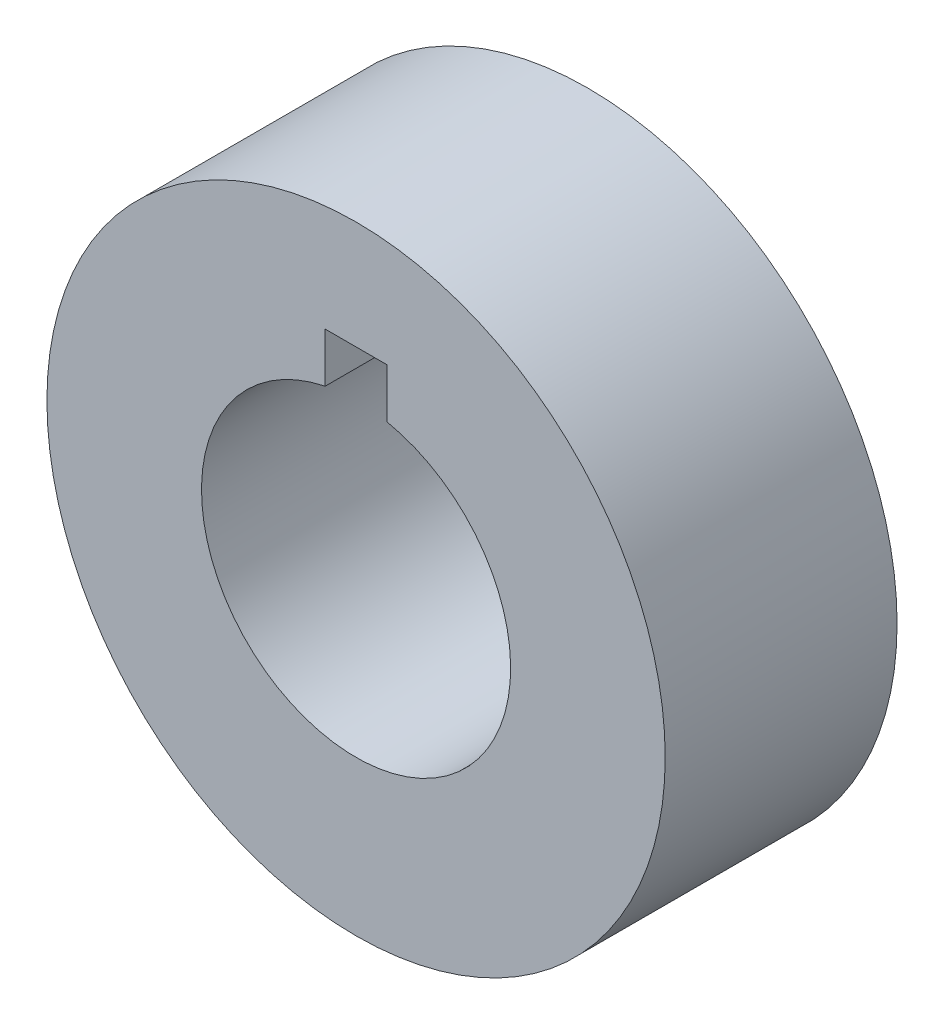
ISO-10303-21;
HEADER;
FILE_DESCRIPTION(('STEP AP214'),'2;1');
FILE_NAME('part.step','',(''),(''),'','','');
FILE_SCHEMA(('AUTOMOTIVE_DESIGN { 1 0 10303 214 1 1 1 1 }'));
ENDSEC;
DATA;
#1=APPLICATION_CONTEXT('core data for automotive mechanical design processes');
#2=APPLICATION_PROTOCOL_DEFINITION('international standard','automotive_design',2000,#1);
#3=PRODUCT_CONTEXT('',#1,'mechanical');
#4=PRODUCT('Part','Part','',(#3));
#5=PRODUCT_RELATED_PRODUCT_CATEGORY('part','',(#4));
#6=PRODUCT_DEFINITION_FORMATION('','',#4);
#7=PRODUCT_DEFINITION_CONTEXT('part definition',#1,'design');
#8=PRODUCT_DEFINITION('design','',#6,#7);
#9=PRODUCT_DEFINITION_SHAPE('','',#8);
#10=(LENGTH_UNIT() NAMED_UNIT(*) SI_UNIT(.MILLI.,.METRE.));
#11=(NAMED_UNIT(*) PLANE_ANGLE_UNIT() SI_UNIT($,.RADIAN.));
#12=(NAMED_UNIT(*) SI_UNIT($,.STERADIAN.) SOLID_ANGLE_UNIT());
#13=UNCERTAINTY_MEASURE_WITH_UNIT(LENGTH_MEASURE(1.E-05),#10,'distance_accuracy_value','');
#14=(GEOMETRIC_REPRESENTATION_CONTEXT(3) GLOBAL_UNCERTAINTY_ASSIGNED_CONTEXT((#13)) GLOBAL_UNIT_ASSIGNED_CONTEXT((#10,
#11,#12)) REPRESENTATION_CONTEXT('',''));
#15=CARTESIAN_POINT('',(0.,0.,0.));
#16=DIRECTION('',(0.,0.,1.));
#17=DIRECTION('',(1.,0.,0.));
#18=AXIS2_PLACEMENT_3D('',#15,#16,#17);
#19=CARTESIAN_POINT('',(0.,0.,19.05));
#20=DIRECTION('',(0.,0.,1.));
#21=DIRECTION('',(1.,0.,0.));
#22=AXIS2_PLACEMENT_3D('',#19,#20,#21);
#23=PLANE('',#22);
#24=CARTESIAN_POINT('',(0.,0.,19.05));
#25=DIRECTION('',(0.,0.,1.));
#26=DIRECTION('',(1.,0.,0.));
#27=AXIS2_PLACEMENT_3D('',#24,#25,#26);
#28=CIRCLE('',#27,25.4);
#29=CARTESIAN_POINT('',(-25.4,0.,19.05));
#30=VERTEX_POINT('',#29);
#31=EDGE_CURVE('E11',#30,#30,#28,.T.);
#32=ORIENTED_EDGE('',*,*,#31,.T.);
#33=EDGE_LOOP('',(#32));
#34=FACE_BOUND('',#33,.T.);
#35=CARTESIAN_POINT('',(0.,0.,19.05));
#36=DIRECTION('',(0.,0.,1.));
#37=DIRECTION('',(1.,0.,0.));
#38=AXIS2_PLACEMENT_3D('',#35,#36,#37);
#39=CIRCLE('',#38,12.7);
#40=CARTESIAN_POINT('',(-2.54,12.4434078933385,19.05));
#41=VERTEX_POINT('',#40);
#42=CARTESIAN_POINT('',(2.54,12.4434078933385,19.05));
#43=VERTEX_POINT('',#42);
#44=EDGE_CURVE('E82',#41,#43,#39,.T.);
#45=ORIENTED_EDGE('',*,*,#44,.F.);
#46=DIRECTION('',(0.,-1.,0.));
#47=VECTOR('',#46,1.);
#48=CARTESIAN_POINT('',(-2.54,16.51,19.05));
#49=LINE('',#48,#47);
#50=CARTESIAN_POINT('',(-2.54,16.51,19.05));
#51=VERTEX_POINT('',#50);
#52=EDGE_CURVE('E74',#51,#41,#49,.T.);
#53=ORIENTED_EDGE('',*,*,#52,.F.);
#54=DIRECTION('',(-1.,0.,0.));
#55=VECTOR('',#54,1.);
#56=CARTESIAN_POINT('',(-2.54,16.51,19.05));
#57=LINE('',#56,#55);
#58=CARTESIAN_POINT('',(2.54,16.51,19.05));
#59=VERTEX_POINT('',#58);
#60=EDGE_CURVE('E95',#59,#51,#57,.T.);
#61=ORIENTED_EDGE('',*,*,#60,.F.);
#62=DIRECTION('',(0.,1.,0.));
#63=VECTOR('',#62,1.);
#64=CARTESIAN_POINT('',(2.54,16.51,19.05));
#65=LINE('',#64,#63);
#66=EDGE_CURVE('E93',#43,#59,#65,.T.);
#67=ORIENTED_EDGE('',*,*,#66,.F.);
#68=EDGE_LOOP('',(#45,#53,#61,#67));
#69=FACE_BOUND('',#68,.T.);
#70=ADVANCED_FACE('F33',(#34,#69),#23,.T.);
#71=CARTESIAN_POINT('',(0.,0.,0.));
#72=DIRECTION('',(0.,0.,1.));
#73=DIRECTION('',(1.,0.,0.));
#74=AXIS2_PLACEMENT_3D('',#71,#72,#73);
#75=PLANE('',#74);
#76=CARTESIAN_POINT('',(0.,0.,0.));
#77=DIRECTION('',(0.,0.,1.));
#78=DIRECTION('',(1.,0.,0.));
#79=AXIS2_PLACEMENT_3D('',#76,#77,#78);
#80=CIRCLE('',#79,25.4);
#81=CARTESIAN_POINT('',(-25.4,0.,0.));
#82=VERTEX_POINT('',#81);
#83=EDGE_CURVE('E37',#82,#82,#80,.T.);
#84=ORIENTED_EDGE('',*,*,#83,.F.);
#85=EDGE_LOOP('',(#84));
#86=FACE_BOUND('',#85,.T.);
#87=DIRECTION('',(0.,-1.,0.));
#88=VECTOR('',#87,1.);
#89=CARTESIAN_POINT('',(-2.54,16.51,0.));
#90=LINE('',#89,#88);
#91=CARTESIAN_POINT('',(-2.54,16.51,0.));
#92=VERTEX_POINT('',#91);
#93=CARTESIAN_POINT('',(-2.54,12.4434078933385,0.));
#94=VERTEX_POINT('',#93);
#95=EDGE_CURVE('E56',#92,#94,#90,.T.);
#96=ORIENTED_EDGE('',*,*,#95,.T.);
#97=CARTESIAN_POINT('',(0.,0.,0.));
#98=DIRECTION('',(0.,0.,1.));
#99=DIRECTION('',(1.,0.,0.));
#100=AXIS2_PLACEMENT_3D('',#97,#98,#99);
#101=CIRCLE('',#100,12.7);
#102=CARTESIAN_POINT('',(2.54,12.4434078933385,0.));
#103=VERTEX_POINT('',#102);
#104=EDGE_CURVE('E89',#94,#103,#101,.T.);
#105=ORIENTED_EDGE('',*,*,#104,.T.);
#106=DIRECTION('',(0.,1.,0.));
#107=VECTOR('',#106,1.);
#108=CARTESIAN_POINT('',(2.54,16.51,0.));
#109=LINE('',#108,#107);
#110=CARTESIAN_POINT('',(2.54,16.51,0.));
#111=VERTEX_POINT('',#110);
#112=EDGE_CURVE('E101',#103,#111,#109,.T.);
#113=ORIENTED_EDGE('',*,*,#112,.T.);
#114=DIRECTION('',(-1.,0.,0.));
#115=VECTOR('',#114,1.);
#116=CARTESIAN_POINT('',(-2.54,16.51,0.));
#117=LINE('',#116,#115);
#118=EDGE_CURVE('E83',#111,#92,#117,.T.);
#119=ORIENTED_EDGE('',*,*,#118,.T.);
#120=EDGE_LOOP('',(#96,#105,#113,#119));
#121=FACE_BOUND('',#120,.T.);
#122=ADVANCED_FACE('F112',(#86,#121),#75,.F.);
#123=CARTESIAN_POINT('',(0.,0.,19.05));
#124=DIRECTION('',(0.,0.,-1.));
#125=DIRECTION('',(-1.,0.,0.));
#126=AXIS2_PLACEMENT_3D('',#123,#124,#125);
#127=CYLINDRICAL_SURFACE('',#126,25.4);
#128=CARTESIAN_POINT('',(-25.4,0.,19.05));
#129=CARTESIAN_POINT('',(-25.4,0.,18.8515625));
#130=CARTESIAN_POINT('',(-25.4,0.,18.653125));
#131=CARTESIAN_POINT('',(-25.4,0.,18.25625));
#132=CARTESIAN_POINT('',(-25.4,0.,18.0578125));
#133=CARTESIAN_POINT('',(-25.4,0.,17.6609375));
#134=CARTESIAN_POINT('',(-25.4,0.,17.4625));
#135=CARTESIAN_POINT('',(-25.4,0.,17.065625));
#136=CARTESIAN_POINT('',(-25.4,0.,16.8671875));
#137=CARTESIAN_POINT('',(-25.4,0.,16.4703125));
#138=CARTESIAN_POINT('',(-25.4,0.,16.271875));
#139=CARTESIAN_POINT('',(-25.4,0.,15.875));
#140=CARTESIAN_POINT('',(-25.4,0.,15.6765625));
#141=CARTESIAN_POINT('',(-25.4,0.,15.2796875));
#142=CARTESIAN_POINT('',(-25.4,0.,15.08125));
#143=CARTESIAN_POINT('',(-25.4,0.,14.684375));
#144=CARTESIAN_POINT('',(-25.4,0.,14.4859375));
#145=CARTESIAN_POINT('',(-25.4,0.,14.0890625));
#146=CARTESIAN_POINT('',(-25.4,0.,13.890625));
#147=CARTESIAN_POINT('',(-25.4,0.,13.49375));
#148=CARTESIAN_POINT('',(-25.4,0.,13.2953125));
#149=CARTESIAN_POINT('',(-25.4,0.,12.8984375));
#150=CARTESIAN_POINT('',(-25.4,0.,12.7));
#151=CARTESIAN_POINT('',(-25.4,0.,12.303125));
#152=CARTESIAN_POINT('',(-25.4,0.,12.1046875));
#153=CARTESIAN_POINT('',(-25.4,0.,11.7078125));
#154=CARTESIAN_POINT('',(-25.4,0.,11.509375));
#155=CARTESIAN_POINT('',(-25.4,0.,11.1125));
#156=CARTESIAN_POINT('',(-25.4,0.,10.9140625));
#157=CARTESIAN_POINT('',(-25.4,0.,10.5171875));
#158=CARTESIAN_POINT('',(-25.4,0.,10.31875));
#159=CARTESIAN_POINT('',(-25.4,0.,9.921875));
#160=CARTESIAN_POINT('',(-25.4,0.,9.7234375));
#161=CARTESIAN_POINT('',(-25.4,0.,9.3265625));
#162=CARTESIAN_POINT('',(-25.4,0.,9.128125));
#163=CARTESIAN_POINT('',(-25.4,0.,8.73125));
#164=CARTESIAN_POINT('',(-25.4,0.,8.5328125));
#165=CARTESIAN_POINT('',(-25.4,0.,8.1359375));
#166=CARTESIAN_POINT('',(-25.4,0.,7.9375));
#167=CARTESIAN_POINT('',(-25.4,0.,7.540625));
#168=CARTESIAN_POINT('',(-25.4,0.,7.3421875));
#169=CARTESIAN_POINT('',(-25.4,0.,6.9453125));
#170=CARTESIAN_POINT('',(-25.4,0.,6.746875));
#171=CARTESIAN_POINT('',(-25.4,0.,6.35));
#172=CARTESIAN_POINT('',(-25.4,0.,6.1515625));
#173=CARTESIAN_POINT('',(-25.4,0.,5.7546875));
#174=CARTESIAN_POINT('',(-25.4,0.,5.55625));
#175=CARTESIAN_POINT('',(-25.4,0.,5.159375));
#176=CARTESIAN_POINT('',(-25.4,0.,4.9609375));
#177=CARTESIAN_POINT('',(-25.4,0.,4.5640625));
#178=CARTESIAN_POINT('',(-25.4,0.,4.365625));
#179=CARTESIAN_POINT('',(-25.4,0.,3.96875));
#180=CARTESIAN_POINT('',(-25.4,0.,3.7703125));
#181=CARTESIAN_POINT('',(-25.4,0.,3.3734375));
#182=CARTESIAN_POINT('',(-25.4,0.,3.175));
#183=CARTESIAN_POINT('',(-25.4,0.,2.778125));
#184=CARTESIAN_POINT('',(-25.4,0.,2.5796875));
#185=CARTESIAN_POINT('',(-25.4,0.,2.1828125));
#186=CARTESIAN_POINT('',(-25.4,0.,1.984375));
#187=CARTESIAN_POINT('',(-25.4,0.,1.5875));
#188=CARTESIAN_POINT('',(-25.4,0.,1.3890625));
#189=CARTESIAN_POINT('',(-25.4,0.,0.992187500000001));
#190=CARTESIAN_POINT('',(-25.4,0.,0.793750000000001));
#191=CARTESIAN_POINT('',(-25.4,0.,0.396875));
#192=CARTESIAN_POINT('',(-25.4,0.,0.1984375));
#193=CARTESIAN_POINT('',(-25.4,0.,0.));
#194=B_SPLINE_CURVE_WITH_KNOTS('',3,(#128,#129,#130,#131,#132,#133,#134,#135,#136,#137,#138,
#139,#140,#141,#142,#143,#144,#145,#146,#147,#148,#149,#150,#151,#152,#153,#154,#155,#156,#157,
#158,#159,#160,#161,#162,#163,#164,#165,#166,#167,#168,#169,#170,#171,#172,#173,#174,#175,#176,
#177,#178,#179,#180,#181,#182,#183,#184,#185,#186,#187,#188,#189,#190,#191,#192,#193),
.UNSPECIFIED.,.F.,.F.,(4,2,2,2,2,2,2,2,2,2,2,2,2,2,2,2,2,2,2,2,2,2,2,2,2,2,2,2,2,2,2,2,4),(0.,
0.5953125,1.190625,1.7859375,2.38125,2.9765625,3.571875,4.1671875,4.7625,5.3578125,5.953125,
6.5484375,7.14375,7.7390625,8.334375,8.9296875,9.525,10.1203125,10.715625,11.3109375,11.90625,
12.5015625,13.096875,13.6921875,14.2875,14.8828125,15.478125,16.0734375,16.66875,17.2640625,
17.859375,18.4546875,19.05),.UNSPECIFIED.);
#195=EDGE_CURVE('BSEAM35',#30,#82,#194,.T.);
#196=ORIENTED_EDGE('',*,*,#31,.F.);
#197=ORIENTED_EDGE('',*,*,#83,.T.);
#198=ORIENTED_EDGE('',*,*,#195,.T.);
#199=ORIENTED_EDGE('',*,*,#195,.F.);
#200=EDGE_LOOP('',(#196,#198,#197,#199));
#201=FACE_BOUND('',#200,.T.);
#202=ADVANCED_FACE('F35',(#201),#127,.T.);
#203=CARTESIAN_POINT('',(-2.54,16.51,19.05));
#204=DIRECTION('',(1.,0.,0.));
#205=DIRECTION('',(0.,1.,0.));
#206=AXIS2_PLACEMENT_3D('',#203,#204,#205);
#207=PLANE('',#206);
#208=ORIENTED_EDGE('',*,*,#95,.F.);
#209=DIRECTION('',(0.,0.,-1.));
#210=VECTOR('',#209,1.);
#211=CARTESIAN_POINT('',(-2.54,16.51,19.05));
#212=LINE('',#211,#210);
#213=EDGE_CURVE('E78',#51,#92,#212,.T.);
#214=ORIENTED_EDGE('',*,*,#213,.F.);
#215=ORIENTED_EDGE('',*,*,#52,.T.);
#216=DIRECTION('',(0.,0.,-1.));
#217=VECTOR('',#216,1.);
#218=CARTESIAN_POINT('',(-2.54,12.4434078933385,19.05));
#219=LINE('',#218,#217);
#220=EDGE_CURVE('E77',#41,#94,#219,.T.);
#221=ORIENTED_EDGE('',*,*,#220,.T.);
#222=EDGE_LOOP('',(#208,#214,#215,#221));
#223=FACE_BOUND('',#222,.T.);
#224=ADVANCED_FACE('F76',(#223),#207,.T.);
#225=CARTESIAN_POINT('',(0.,0.,19.05));
#226=DIRECTION('',(0.,0.,-1.));
#227=DIRECTION('',(-1.,0.,0.));
#228=AXIS2_PLACEMENT_3D('',#225,#226,#227);
#229=CYLINDRICAL_SURFACE('',#228,12.7);
#230=ORIENTED_EDGE('',*,*,#104,.F.);
#231=ORIENTED_EDGE('',*,*,#220,.F.);
#232=ORIENTED_EDGE('',*,*,#44,.T.);
#233=DIRECTION('',(0.,0.,-1.));
#234=VECTOR('',#233,1.);
#235=CARTESIAN_POINT('',(2.54,12.4434078933385,19.05));
#236=LINE('',#235,#234);
#237=EDGE_CURVE('E90',#43,#103,#236,.T.);
#238=ORIENTED_EDGE('',*,*,#237,.T.);
#239=EDGE_LOOP('',(#230,#231,#232,#238));
#240=FACE_BOUND('',#239,.T.);
#241=ADVANCED_FACE('F86',(#240),#229,.F.);
#242=CARTESIAN_POINT('',(2.54,16.51,19.05));
#243=DIRECTION('',(-1.,0.,0.));
#244=DIRECTION('',(0.,-1.,0.));
#245=AXIS2_PLACEMENT_3D('',#242,#243,#244);
#246=PLANE('',#245);
#247=ORIENTED_EDGE('',*,*,#112,.F.);
#248=ORIENTED_EDGE('',*,*,#237,.F.);
#249=ORIENTED_EDGE('',*,*,#66,.T.);
#250=DIRECTION('',(0.,0.,-1.));
#251=VECTOR('',#250,1.);
#252=CARTESIAN_POINT('',(2.54,16.51,19.05));
#253=LINE('',#252,#251);
#254=EDGE_CURVE('E48',#59,#111,#253,.T.);
#255=ORIENTED_EDGE('',*,*,#254,.T.);
#256=EDGE_LOOP('',(#247,#248,#249,#255));
#257=FACE_BOUND('',#256,.T.);
#258=ADVANCED_FACE('F110',(#257),#246,.T.);
#259=CARTESIAN_POINT('',(-2.54,16.51,19.05));
#260=DIRECTION('',(0.,-1.,0.));
#261=DIRECTION('',(0.,0.,-1.));
#262=AXIS2_PLACEMENT_3D('',#259,#260,#261);
#263=PLANE('',#262);
#264=ORIENTED_EDGE('',*,*,#118,.F.);
#265=ORIENTED_EDGE('',*,*,#254,.F.);
#266=ORIENTED_EDGE('',*,*,#60,.T.);
#267=ORIENTED_EDGE('',*,*,#213,.T.);
#268=EDGE_LOOP('',(#264,#265,#266,#267));
#269=FACE_BOUND('',#268,.T.);
#270=ADVANCED_FACE('F113',(#269),#263,.T.);
#271=CLOSED_SHELL('',(#70,#122,#202,#224,#241,#258,#270));
#272=MANIFOLD_SOLID_BREP('B2',#271);
#273=ADVANCED_BREP_SHAPE_REPRESENTATION('',(#18,#272),#14);
#274=SHAPE_DEFINITION_REPRESENTATION(#9,#273);
ENDSEC;
END-ISO-10303-21;
